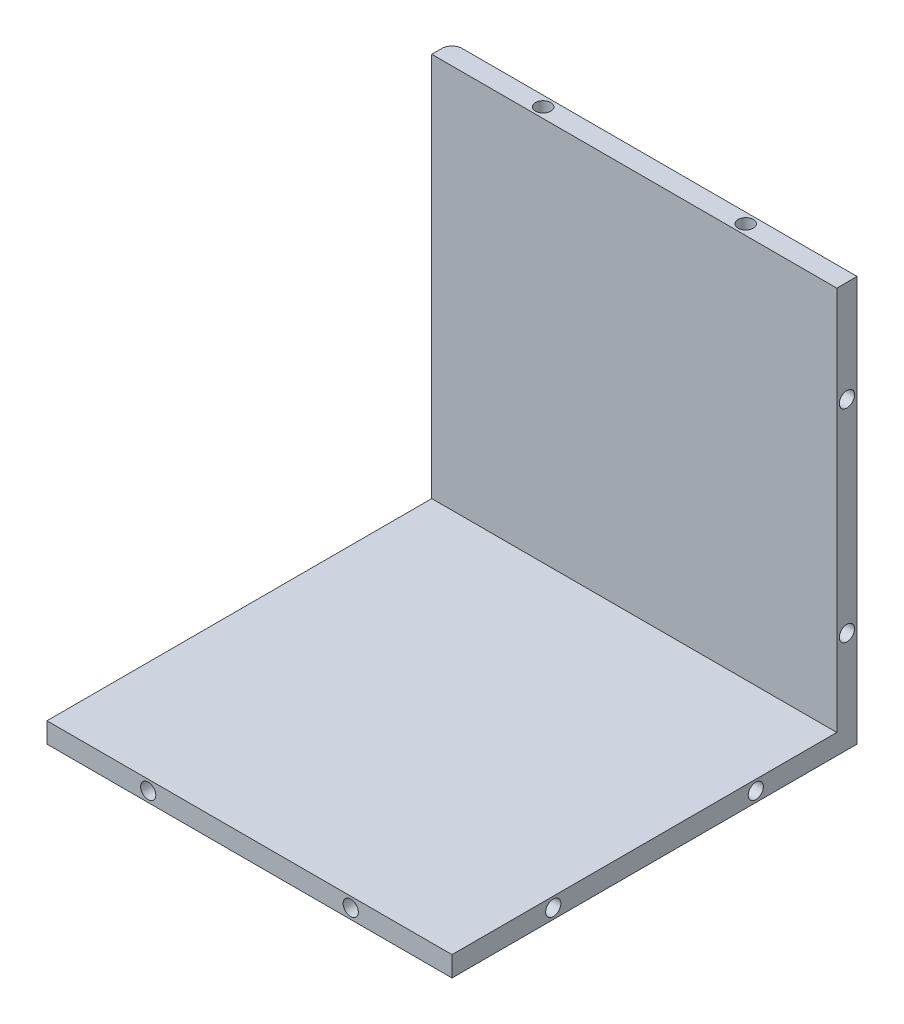
ISO-10303-21;
HEADER;
FILE_DESCRIPTION(('STEP AP214'),'2;1');
FILE_NAME('part.step','',(''),(''),'','','');
FILE_SCHEMA(('AUTOMOTIVE_DESIGN { 1 0 10303 214 1 1 1 1 }'));
ENDSEC;
DATA;
#1=APPLICATION_CONTEXT('core data for automotive mechanical design processes');
#2=APPLICATION_PROTOCOL_DEFINITION('international standard','automotive_design',2000,#1);
#3=PRODUCT_CONTEXT('',#1,'mechanical');
#4=PRODUCT('Part','Part','',(#3));
#5=PRODUCT_RELATED_PRODUCT_CATEGORY('part','',(#4));
#6=PRODUCT_DEFINITION_FORMATION('','',#4);
#7=PRODUCT_DEFINITION_CONTEXT('part definition',#1,'design');
#8=PRODUCT_DEFINITION('design','',#6,#7);
#9=PRODUCT_DEFINITION_SHAPE('','',#8);
#10=(LENGTH_UNIT() NAMED_UNIT(*) SI_UNIT(.MILLI.,.METRE.));
#11=(NAMED_UNIT(*) PLANE_ANGLE_UNIT() SI_UNIT($,.RADIAN.));
#12=(NAMED_UNIT(*) SI_UNIT($,.STERADIAN.) SOLID_ANGLE_UNIT());
#13=UNCERTAINTY_MEASURE_WITH_UNIT(LENGTH_MEASURE(1.E-05),#10,'distance_accuracy_value','');
#14=(GEOMETRIC_REPRESENTATION_CONTEXT(3) GLOBAL_UNCERTAINTY_ASSIGNED_CONTEXT((#13)) GLOBAL_UNIT_ASSIGNED_CONTEXT((#10,
#11,#12)) REPRESENTATION_CONTEXT('',''));
#15=CARTESIAN_POINT('',(0.,0.,0.));
#16=DIRECTION('',(0.,0.,1.));
#17=DIRECTION('',(1.,0.,0.));
#18=AXIS2_PLACEMENT_3D('',#15,#16,#17);
#19=CARTESIAN_POINT('',(80.,-2.,0.));
#20=DIRECTION('',(0.,-1.,0.));
#21=DIRECTION('',(0.,0.,-1.));
#22=AXIS2_PLACEMENT_3D('',#19,#20,#21);
#23=PLANE('',#22);
#24=CARTESIAN_POINT('',(3.75,-1.99999999999999,-103.5));
#25=DIRECTION('',(0.,-1.,0.));
#26=DIRECTION('',(0.,0.,-1.));
#27=AXIS2_PLACEMENT_3D('',#24,#25,#26);
#28=CIRCLE('',#27,1.5);
#29=CARTESIAN_POINT('',(3.75,-1.99999999999999,-105.));
#30=VERTEX_POINT('',#29);
#31=EDGE_CURVE('E257',#30,#30,#28,.T.);
#32=ORIENTED_EDGE('',*,*,#31,.F.);
#33=EDGE_LOOP('',(#32));
#34=FACE_BOUND('',#33,.T.);
#35=DIRECTION('',(0.,0.,1.));
#36=VECTOR('',#35,1.);
#37=CARTESIAN_POINT('',(40.,-2.,-110.));
#38=LINE('',#37,#36);
#39=CARTESIAN_POINT('',(40.,-2.,-110.));
#40=VERTEX_POINT('',#39);
#41=CARTESIAN_POINT('',(40.,-2.,-70.));
#42=VERTEX_POINT('',#41);
#43=EDGE_CURVE('E114',#40,#42,#38,.T.);
#44=ORIENTED_EDGE('',*,*,#43,.T.);
#45=DIRECTION('',(1.,0.,0.));
#46=VECTOR('',#45,1.);
#47=CARTESIAN_POINT('',(0.,-2.,-70.));
#48=LINE('',#47,#46);
#49=CARTESIAN_POINT('',(0.,-2.,-70.));
#50=VERTEX_POINT('',#49);
#51=EDGE_CURVE('E57',#50,#42,#48,.T.);
#52=ORIENTED_EDGE('',*,*,#51,.F.);
#53=DIRECTION('',(0.,0.,1.));
#54=VECTOR('',#53,1.);
#55=CARTESIAN_POINT('',(0.,-2.,0.));
#56=LINE('',#55,#54);
#57=CARTESIAN_POINT('',(0.,-1.99999999999999,-109.));
#58=VERTEX_POINT('',#57);
#59=EDGE_CURVE('E112',#58,#50,#56,.T.);
#60=ORIENTED_EDGE('',*,*,#59,.F.);
#61=CARTESIAN_POINT('',(1.,-1.99999999999999,-109.));
#62=DIRECTION('',(0.,-1.,0.));
#63=DIRECTION('',(0.,0.,-1.));
#64=AXIS2_PLACEMENT_3D('',#61,#62,#63);
#65=CIRCLE('',#64,1.);
#66=CARTESIAN_POINT('',(1.,-1.99999999999999,-110.));
#67=VERTEX_POINT('',#66);
#68=EDGE_CURVE('E147',#58,#67,#65,.T.);
#69=ORIENTED_EDGE('',*,*,#68,.T.);
#70=DIRECTION('',(-1.,0.,0.));
#71=VECTOR('',#70,1.);
#72=CARTESIAN_POINT('',(80.,-1.99999999999999,-110.));
#73=LINE('',#72,#71);
#74=EDGE_CURVE('E142',#40,#67,#73,.T.);
#75=ORIENTED_EDGE('',*,*,#74,.F.);
#76=EDGE_LOOP('',(#44,#52,#60,#69,#75));
#77=FACE_BOUND('',#76,.T.);
#78=ADVANCED_FACE('F41',(#34,#77),#23,.T.);
#79=CARTESIAN_POINT('',(80.,0.,0.));
#80=DIRECTION('',(0.,1.,0.));
#81=DIRECTION('',(0.,0.,1.));
#82=AXIS2_PLACEMENT_3D('',#79,#80,#81);
#83=PLANE('',#82);
#84=DIRECTION('',(0.,0.,-1.));
#85=VECTOR('',#84,1.);
#86=CARTESIAN_POINT('',(0.,0.,0.));
#87=LINE('',#86,#85);
#88=CARTESIAN_POINT('',(0.,0.,-70.));
#89=VERTEX_POINT('',#88);
#90=CARTESIAN_POINT('',(0.,0.,-108.));
#91=VERTEX_POINT('',#90);
#92=EDGE_CURVE('E130',#89,#91,#87,.T.);
#93=ORIENTED_EDGE('',*,*,#92,.F.);
#94=DIRECTION('',(-1.,0.,0.));
#95=VECTOR('',#94,1.);
#96=CARTESIAN_POINT('',(40.,0.,-70.));
#97=LINE('',#96,#95);
#98=CARTESIAN_POINT('',(40.,0.,-70.));
#99=VERTEX_POINT('',#98);
#100=EDGE_CURVE('E101',#99,#89,#97,.T.);
#101=ORIENTED_EDGE('',*,*,#100,.F.);
#102=DIRECTION('',(0.,0.,1.));
#103=VECTOR('',#102,1.);
#104=CARTESIAN_POINT('',(40.,0.,0.));
#105=LINE('',#104,#103);
#106=CARTESIAN_POINT('',(40.,0.,-108.));
#107=VERTEX_POINT('',#106);
#108=EDGE_CURVE('E132',#107,#99,#105,.T.);
#109=ORIENTED_EDGE('',*,*,#108,.F.);
#110=DIRECTION('',(-1.,0.,0.));
#111=VECTOR('',#110,1.);
#112=CARTESIAN_POINT('',(80.,0.,-108.));
#113=LINE('',#112,#111);
#114=EDGE_CURVE('E138',#107,#91,#113,.T.);
#115=ORIENTED_EDGE('',*,*,#114,.T.);
#116=EDGE_LOOP('',(#93,#101,#109,#115));
#117=FACE_BOUND('',#116,.T.);
#118=ADVANCED_FACE('F181',(#117),#83,.T.);
#119=CARTESIAN_POINT('',(0.,0.,0.));
#120=DIRECTION('',(1.,0.,0.));
#121=DIRECTION('',(0.,0.,-1.));
#122=AXIS2_PLACEMENT_3D('',#119,#120,#121);
#123=PLANE('',#122);
#124=DIRECTION('',(0.,-1.,0.));
#125=VECTOR('',#124,1.);
#126=CARTESIAN_POINT('',(0.,0.,-70.));
#127=LINE('',#126,#125);
#128=EDGE_CURVE('E98',#89,#50,#127,.T.);
#129=ORIENTED_EDGE('',*,*,#128,.F.);
#130=ORIENTED_EDGE('',*,*,#92,.T.);
#131=DIRECTION('',(0.,1.,0.));
#132=VECTOR('',#131,1.);
#133=CARTESIAN_POINT('',(0.,0.,-108.));
#134=LINE('',#133,#132);
#135=CARTESIAN_POINT('',(0.,38.,-108.));
#136=VERTEX_POINT('',#135);
#137=EDGE_CURVE('E124',#91,#136,#134,.T.);
#138=ORIENTED_EDGE('',*,*,#137,.T.);
#139=DIRECTION('',(0.,0.,1.));
#140=VECTOR('',#139,1.);
#141=CARTESIAN_POINT('',(0.,38.,-110.));
#142=LINE('',#141,#140);
#143=CARTESIAN_POINT('',(0.,38.,-109.));
#144=VERTEX_POINT('',#143);
#145=EDGE_CURVE('E157',#144,#136,#142,.T.);
#146=ORIENTED_EDGE('',*,*,#145,.F.);
#147=DIRECTION('',(0.,-1.,0.));
#148=VECTOR('',#147,1.);
#149=CARTESIAN_POINT('',(0.,-1.99999999999999,-109.));
#150=LINE('',#149,#148);
#151=EDGE_CURVE('E121',#144,#58,#150,.T.);
#152=ORIENTED_EDGE('',*,*,#151,.T.);
#153=ORIENTED_EDGE('',*,*,#59,.T.);
#154=EDGE_LOOP('',(#129,#130,#138,#146,#152,#153));
#155=FACE_BOUND('',#154,.T.);
#156=ADVANCED_FACE('F118',(#155),#123,.F.);
#157=CARTESIAN_POINT('',(40.,0.,-110.));
#158=DIRECTION('',(-1.,0.,0.));
#159=DIRECTION('',(0.,-1.,0.));
#160=AXIS2_PLACEMENT_3D('',#157,#158,#159);
#161=PLANE('',#160);
#162=CARTESIAN_POINT('',(40.,28.,-109.));
#163=DIRECTION('',(1.,0.,0.));
#164=DIRECTION('',(0.,0.,-1.));
#165=AXIS2_PLACEMENT_3D('',#162,#163,#164);
#166=CIRCLE('',#165,0.749999999999999);
#167=CARTESIAN_POINT('',(40.,28.,-109.75));
#168=VERTEX_POINT('',#167);
#169=EDGE_CURVE('E234',#168,#168,#166,.T.);
#170=ORIENTED_EDGE('',*,*,#169,.F.);
#171=EDGE_LOOP('',(#170));
#172=FACE_BOUND('',#171,.T.);
#173=CARTESIAN_POINT('',(40.,8.,-109.));
#174=DIRECTION('',(1.,0.,0.));
#175=DIRECTION('',(0.,0.,-1.));
#176=AXIS2_PLACEMENT_3D('',#173,#174,#175);
#177=CIRCLE('',#176,0.749999999999999);
#178=CARTESIAN_POINT('',(40.,8.,-109.75));
#179=VERTEX_POINT('',#178);
#180=EDGE_CURVE('E230',#179,#179,#177,.T.);
#181=ORIENTED_EDGE('',*,*,#180,.F.);
#182=EDGE_LOOP('',(#181));
#183=FACE_BOUND('',#182,.T.);
#184=CARTESIAN_POINT('',(40.,-0.999999999999994,-100.));
#185=DIRECTION('',(1.,0.,0.));
#186=DIRECTION('',(0.,0.,-1.));
#187=AXIS2_PLACEMENT_3D('',#184,#185,#186);
#188=CIRCLE('',#187,0.749999999999999);
#189=CARTESIAN_POINT('',(40.,-0.999999999999994,-100.75));
#190=VERTEX_POINT('',#189);
#191=EDGE_CURVE('E222',#190,#190,#188,.T.);
#192=ORIENTED_EDGE('',*,*,#191,.F.);
#193=EDGE_LOOP('',(#192));
#194=FACE_BOUND('',#193,.T.);
#195=CARTESIAN_POINT('',(40.,-0.999999999999995,-80.));
#196=DIRECTION('',(1.,0.,0.));
#197=DIRECTION('',(0.,0.,-1.));
#198=AXIS2_PLACEMENT_3D('',#195,#196,#197);
#199=CIRCLE('',#198,0.749999999999999);
#200=CARTESIAN_POINT('',(40.,-0.999999999999995,-80.75));
#201=VERTEX_POINT('',#200);
#202=EDGE_CURVE('E213',#201,#201,#199,.T.);
#203=ORIENTED_EDGE('',*,*,#202,.F.);
#204=EDGE_LOOP('',(#203));
#205=FACE_BOUND('',#204,.T.);
#206=DIRECTION('',(0.,1.,0.));
#207=VECTOR('',#206,1.);
#208=CARTESIAN_POINT('',(40.,-2.,-70.));
#209=LINE('',#208,#207);
#210=EDGE_CURVE('E116',#42,#99,#209,.T.);
#211=ORIENTED_EDGE('',*,*,#210,.F.);
#212=ORIENTED_EDGE('',*,*,#43,.F.);
#213=DIRECTION('',(0.,-1.,0.));
#214=VECTOR('',#213,1.);
#215=CARTESIAN_POINT('',(40.,0.,-110.));
#216=LINE('',#215,#214);
#217=CARTESIAN_POINT('',(40.,38.,-110.));
#218=VERTEX_POINT('',#217);
#219=EDGE_CURVE('E162',#218,#40,#216,.T.);
#220=ORIENTED_EDGE('',*,*,#219,.F.);
#221=DIRECTION('',(0.,0.,1.));
#222=VECTOR('',#221,1.);
#223=CARTESIAN_POINT('',(40.,38.,-110.));
#224=LINE('',#223,#222);
#225=CARTESIAN_POINT('',(40.,38.,-108.));
#226=VERTEX_POINT('',#225);
#227=EDGE_CURVE('E161',#218,#226,#224,.T.);
#228=ORIENTED_EDGE('',*,*,#227,.T.);
#229=DIRECTION('',(0.,-1.,0.));
#230=VECTOR('',#229,1.);
#231=CARTESIAN_POINT('',(40.,0.,-108.));
#232=LINE('',#231,#230);
#233=EDGE_CURVE('E125',#226,#107,#232,.T.);
#234=ORIENTED_EDGE('',*,*,#233,.T.);
#235=ORIENTED_EDGE('',*,*,#108,.T.);
#236=EDGE_LOOP('',(#211,#212,#220,#228,#234,#235));
#237=FACE_BOUND('',#236,.T.);
#238=ADVANCED_FACE('F177',(#172,#183,#194,#205,#237),#161,.F.);
#239=CARTESIAN_POINT('',(80.,0.,-110.));
#240=DIRECTION('',(0.,0.,-1.));
#241=DIRECTION('',(0.,1.,0.));
#242=AXIS2_PLACEMENT_3D('',#239,#240,#241);
#243=PLANE('',#242);
#244=ORIENTED_EDGE('',*,*,#219,.T.);
#245=ORIENTED_EDGE('',*,*,#74,.T.);
#246=DIRECTION('',(0.,-1.,0.));
#247=VECTOR('',#246,1.);
#248=CARTESIAN_POINT('',(1.,108.,-110.));
#249=LINE('',#248,#247);
#250=CARTESIAN_POINT('',(1.,38.,-110.));
#251=VERTEX_POINT('',#250);
#252=EDGE_CURVE('E50',#67,#251,#249,.F.);
#253=ORIENTED_EDGE('',*,*,#252,.T.);
#254=DIRECTION('',(1.,0.,0.));
#255=VECTOR('',#254,1.);
#256=CARTESIAN_POINT('',(0.,38.,-110.));
#257=LINE('',#256,#255);
#258=EDGE_CURVE('E64',#251,#218,#257,.T.);
#259=ORIENTED_EDGE('',*,*,#258,.T.);
#260=EDGE_LOOP('',(#244,#245,#253,#259));
#261=FACE_BOUND('',#260,.T.);
#262=ADVANCED_FACE('F154',(#261),#243,.T.);
#263=CARTESIAN_POINT('',(80.,0.,-108.));
#264=DIRECTION('',(0.,0.,1.));
#265=DIRECTION('',(1.,0.,0.));
#266=AXIS2_PLACEMENT_3D('',#263,#264,#265);
#267=PLANE('',#266);
#268=ORIENTED_EDGE('',*,*,#233,.F.);
#269=DIRECTION('',(1.,0.,0.));
#270=VECTOR('',#269,1.);
#271=CARTESIAN_POINT('',(80.,38.,-108.));
#272=LINE('',#271,#270);
#273=EDGE_CURVE('E171',#136,#226,#272,.T.);
#274=ORIENTED_EDGE('',*,*,#273,.F.);
#275=ORIENTED_EDGE('',*,*,#137,.F.);
#276=ORIENTED_EDGE('',*,*,#114,.F.);
#277=EDGE_LOOP('',(#268,#274,#275,#276));
#278=FACE_BOUND('',#277,.T.);
#279=ADVANCED_FACE('F183',(#278),#267,.T.);
#280=CARTESIAN_POINT('',(1.,0.,-109.));
#281=DIRECTION('',(0.,1.,0.));
#282=DIRECTION('',(0.,0.,1.));
#283=AXIS2_PLACEMENT_3D('',#280,#281,#282);
#284=CYLINDRICAL_SURFACE('',#283,1.);
#285=CARTESIAN_POINT('',(1.,38.,-109.));
#286=DIRECTION('',(0.,-1.,0.));
#287=DIRECTION('',(1.,0.,0.));
#288=AXIS2_PLACEMENT_3D('',#285,#286,#287);
#289=CIRCLE('',#288,1.);
#290=EDGE_CURVE('E11',#251,#144,#289,.F.);
#291=ORIENTED_EDGE('',*,*,#290,.F.);
#292=ORIENTED_EDGE('',*,*,#252,.F.);
#293=ORIENTED_EDGE('',*,*,#68,.F.);
#294=ORIENTED_EDGE('',*,*,#151,.F.);
#295=EDGE_LOOP('',(#291,#292,#293,#294));
#296=FACE_BOUND('',#295,.T.);
#297=ADVANCED_FACE('F43',(#296),#284,.T.);
#298=CARTESIAN_POINT('',(0.,38.,-110.));
#299=DIRECTION('',(0.,-1.,0.));
#300=DIRECTION('',(1.,0.,0.));
#301=AXIS2_PLACEMENT_3D('',#298,#299,#300);
#302=PLANE('',#301);
#303=CARTESIAN_POINT('',(30.,38.,-109.));
#304=DIRECTION('',(0.,1.,0.));
#305=DIRECTION('',(-1.,0.,0.));
#306=AXIS2_PLACEMENT_3D('',#303,#304,#305);
#307=CIRCLE('',#306,0.750000000000002);
#308=CARTESIAN_POINT('',(29.25,38.,-109.));
#309=VERTEX_POINT('',#308);
#310=EDGE_CURVE('E202',#309,#309,#307,.T.);
#311=ORIENTED_EDGE('',*,*,#310,.F.);
#312=EDGE_LOOP('',(#311));
#313=FACE_BOUND('',#312,.T.);
#314=CARTESIAN_POINT('',(10.,38.,-109.));
#315=DIRECTION('',(0.,1.,0.));
#316=DIRECTION('',(-1.,0.,0.));
#317=AXIS2_PLACEMENT_3D('',#314,#315,#316);
#318=CIRCLE('',#317,0.749999999999999);
#319=CARTESIAN_POINT('',(9.25000000000001,38.,-109.));
#320=VERTEX_POINT('',#319);
#321=EDGE_CURVE('E197',#320,#320,#318,.T.);
#322=ORIENTED_EDGE('',*,*,#321,.F.);
#323=EDGE_LOOP('',(#322));
#324=FACE_BOUND('',#323,.T.);
#325=ORIENTED_EDGE('',*,*,#273,.T.);
#326=ORIENTED_EDGE('',*,*,#227,.F.);
#327=ORIENTED_EDGE('',*,*,#258,.F.);
#328=ORIENTED_EDGE('',*,*,#290,.T.);
#329=ORIENTED_EDGE('',*,*,#145,.T.);
#330=EDGE_LOOP('',(#325,#326,#327,#328,#329));
#331=FACE_BOUND('',#330,.T.);
#332=ADVANCED_FACE('F156',(#313,#324,#331),#302,.F.);
#333=CARTESIAN_POINT('',(0.,0.,-70.));
#334=DIRECTION('',(0.,0.,1.));
#335=DIRECTION('',(1.,0.,0.));
#336=AXIS2_PLACEMENT_3D('',#333,#334,#335);
#337=PLANE('',#336);
#338=CARTESIAN_POINT('',(9.99999999999999,-1.,-70.));
#339=DIRECTION('',(0.,0.,1.));
#340=DIRECTION('',(1.,0.,0.));
#341=AXIS2_PLACEMENT_3D('',#338,#339,#340);
#342=CIRCLE('',#341,0.75);
#343=CARTESIAN_POINT('',(10.75,-1.,-70.));
#344=VERTEX_POINT('',#343);
#345=EDGE_CURVE('E250',#344,#344,#342,.T.);
#346=ORIENTED_EDGE('',*,*,#345,.F.);
#347=EDGE_LOOP('',(#346));
#348=FACE_BOUND('',#347,.T.);
#349=CARTESIAN_POINT('',(30.,-1.,-70.));
#350=DIRECTION('',(0.,0.,1.));
#351=DIRECTION('',(1.,0.,0.));
#352=AXIS2_PLACEMENT_3D('',#349,#350,#351);
#353=CIRCLE('',#352,0.750000000000002);
#354=CARTESIAN_POINT('',(30.75,-1.,-70.));
#355=VERTEX_POINT('',#354);
#356=EDGE_CURVE('E245',#355,#355,#353,.T.);
#357=ORIENTED_EDGE('',*,*,#356,.F.);
#358=EDGE_LOOP('',(#357));
#359=FACE_BOUND('',#358,.T.);
#360=ORIENTED_EDGE('',*,*,#128,.T.);
#361=ORIENTED_EDGE('',*,*,#51,.T.);
#362=ORIENTED_EDGE('',*,*,#210,.T.);
#363=ORIENTED_EDGE('',*,*,#100,.T.);
#364=EDGE_LOOP('',(#360,#361,#362,#363));
#365=FACE_BOUND('',#364,.T.);
#366=ADVANCED_FACE('F99',(#348,#359,#365),#337,.T.);
#367=CARTESIAN_POINT('',(10.,33.,-109.));
#368=DIRECTION('',(0.,1.,0.));
#369=DIRECTION('',(-1.,0.,0.));
#370=AXIS2_PLACEMENT_3D('',#367,#368,#369);
#371=CYLINDRICAL_SURFACE('',#370,0.749999999999999);
#372=CARTESIAN_POINT('',(10.,33.,-109.));
#373=DIRECTION('',(0.,1.,0.));
#374=DIRECTION('',(-1.,0.,0.));
#375=AXIS2_PLACEMENT_3D('',#372,#373,#374);
#376=CIRCLE('',#375,0.749999999999999);
#377=CARTESIAN_POINT('',(9.25000000000001,33.,-109.));
#378=VERTEX_POINT('',#377);
#379=EDGE_CURVE('E193',#378,#378,#376,.T.);
#380=ORIENTED_EDGE('',*,*,#379,.F.);
#381=EDGE_LOOP('',(#380));
#382=FACE_BOUND('',#381,.T.);
#383=ORIENTED_EDGE('',*,*,#321,.T.);
#384=EDGE_LOOP('',(#383));
#385=FACE_BOUND('',#384,.T.);
#386=ADVANCED_FACE('F294',(#382,#385),#371,.F.);
#387=CARTESIAN_POINT('',(10.,33.,-109.));
#388=DIRECTION('',(0.,1.,0.));
#389=DIRECTION('',(-1.,0.,0.));
#390=AXIS2_PLACEMENT_3D('',#387,#388,#389);
#391=PLANE('',#390);
#392=ORIENTED_EDGE('',*,*,#379,.T.);
#393=EDGE_LOOP('',(#392));
#394=FACE_BOUND('',#393,.T.);
#395=ADVANCED_FACE('F296',(#394),#391,.T.);
#396=CARTESIAN_POINT('',(30.,33.,-109.));
#397=DIRECTION('',(0.,1.,0.));
#398=DIRECTION('',(-1.,0.,0.));
#399=AXIS2_PLACEMENT_3D('',#396,#397,#398);
#400=CYLINDRICAL_SURFACE('',#399,0.750000000000002);
#401=CARTESIAN_POINT('',(30.,33.,-109.));
#402=DIRECTION('',(0.,1.,0.));
#403=DIRECTION('',(-1.,0.,0.));
#404=AXIS2_PLACEMENT_3D('',#401,#402,#403);
#405=CIRCLE('',#404,0.750000000000002);
#406=CARTESIAN_POINT('',(29.25,33.,-109.));
#407=VERTEX_POINT('',#406);
#408=EDGE_CURVE('E106',#407,#407,#405,.T.);
#409=ORIENTED_EDGE('',*,*,#408,.F.);
#410=EDGE_LOOP('',(#409));
#411=FACE_BOUND('',#410,.T.);
#412=ORIENTED_EDGE('',*,*,#310,.T.);
#413=EDGE_LOOP('',(#412));
#414=FACE_BOUND('',#413,.T.);
#415=ADVANCED_FACE('F299',(#411,#414),#400,.F.);
#416=CARTESIAN_POINT('',(30.,33.,-109.));
#417=DIRECTION('',(0.,1.,0.));
#418=DIRECTION('',(-1.,0.,0.));
#419=AXIS2_PLACEMENT_3D('',#416,#417,#418);
#420=PLANE('',#419);
#421=ORIENTED_EDGE('',*,*,#408,.T.);
#422=EDGE_LOOP('',(#421));
#423=FACE_BOUND('',#422,.T.);
#424=ADVANCED_FACE('F306',(#423),#420,.T.);
#425=CARTESIAN_POINT('',(35.,-0.999999999999995,-80.));
#426=DIRECTION('',(1.,0.,0.));
#427=DIRECTION('',(0.,0.,-1.));
#428=AXIS2_PLACEMENT_3D('',#425,#426,#427);
#429=CYLINDRICAL_SURFACE('',#428,0.749999999999999);
#430=CARTESIAN_POINT('',(35.,-0.999999999999995,-80.));
#431=DIRECTION('',(1.,0.,0.));
#432=DIRECTION('',(0.,0.,-1.));
#433=AXIS2_PLACEMENT_3D('',#430,#431,#432);
#434=CIRCLE('',#433,0.749999999999999);
#435=CARTESIAN_POINT('',(35.,-0.999999999999995,-80.75));
#436=VERTEX_POINT('',#435);
#437=EDGE_CURVE('E209',#436,#436,#434,.T.);
#438=ORIENTED_EDGE('',*,*,#437,.F.);
#439=EDGE_LOOP('',(#438));
#440=FACE_BOUND('',#439,.T.);
#441=ORIENTED_EDGE('',*,*,#202,.T.);
#442=EDGE_LOOP('',(#441));
#443=FACE_BOUND('',#442,.T.);
#444=ADVANCED_FACE('F310',(#440,#443),#429,.F.);
#445=CARTESIAN_POINT('',(35.,-0.999999999999995,-80.));
#446=DIRECTION('',(1.,0.,0.));
#447=DIRECTION('',(0.,0.,-1.));
#448=AXIS2_PLACEMENT_3D('',#445,#446,#447);
#449=PLANE('',#448);
#450=ORIENTED_EDGE('',*,*,#437,.T.);
#451=EDGE_LOOP('',(#450));
#452=FACE_BOUND('',#451,.T.);
#453=ADVANCED_FACE('F312',(#452),#449,.T.);
#454=CARTESIAN_POINT('',(35.,-0.999999999999994,-100.));
#455=DIRECTION('',(1.,0.,0.));
#456=DIRECTION('',(0.,0.,-1.));
#457=AXIS2_PLACEMENT_3D('',#454,#455,#456);
#458=CYLINDRICAL_SURFACE('',#457,0.749999999999999);
#459=CARTESIAN_POINT('',(35.,-0.999999999999994,-100.));
#460=DIRECTION('',(1.,0.,0.));
#461=DIRECTION('',(0.,0.,-1.));
#462=AXIS2_PLACEMENT_3D('',#459,#460,#461);
#463=CIRCLE('',#462,0.749999999999999);
#464=CARTESIAN_POINT('',(35.,-0.999999999999994,-100.75));
#465=VERTEX_POINT('',#464);
#466=EDGE_CURVE('E218',#465,#465,#463,.T.);
#467=ORIENTED_EDGE('',*,*,#466,.F.);
#468=EDGE_LOOP('',(#467));
#469=FACE_BOUND('',#468,.T.);
#470=ORIENTED_EDGE('',*,*,#191,.T.);
#471=EDGE_LOOP('',(#470));
#472=FACE_BOUND('',#471,.T.);
#473=ADVANCED_FACE('F315',(#469,#472),#458,.F.);
#474=CARTESIAN_POINT('',(35.,-0.999999999999994,-100.));
#475=DIRECTION('',(1.,0.,0.));
#476=DIRECTION('',(0.,0.,-1.));
#477=AXIS2_PLACEMENT_3D('',#474,#475,#476);
#478=PLANE('',#477);
#479=ORIENTED_EDGE('',*,*,#466,.T.);
#480=EDGE_LOOP('',(#479));
#481=FACE_BOUND('',#480,.T.);
#482=ADVANCED_FACE('F320',(#481),#478,.T.);
#483=CARTESIAN_POINT('',(35.,8.,-109.));
#484=DIRECTION('',(1.,0.,0.));
#485=DIRECTION('',(0.,0.,-1.));
#486=AXIS2_PLACEMENT_3D('',#483,#484,#485);
#487=CYLINDRICAL_SURFACE('',#486,0.749999999999999);
#488=CARTESIAN_POINT('',(35.,8.,-109.));
#489=DIRECTION('',(1.,0.,0.));
#490=DIRECTION('',(0.,0.,-1.));
#491=AXIS2_PLACEMENT_3D('',#488,#489,#490);
#492=CIRCLE('',#491,0.749999999999999);
#493=CARTESIAN_POINT('',(35.,8.,-109.75));
#494=VERTEX_POINT('',#493);
#495=EDGE_CURVE('E226',#494,#494,#492,.T.);
#496=ORIENTED_EDGE('',*,*,#495,.F.);
#497=EDGE_LOOP('',(#496));
#498=FACE_BOUND('',#497,.T.);
#499=ORIENTED_EDGE('',*,*,#180,.T.);
#500=EDGE_LOOP('',(#499));
#501=FACE_BOUND('',#500,.T.);
#502=ADVANCED_FACE('F323',(#498,#501),#487,.F.);
#503=CARTESIAN_POINT('',(35.,8.,-109.));
#504=DIRECTION('',(1.,0.,0.));
#505=DIRECTION('',(0.,0.,-1.));
#506=AXIS2_PLACEMENT_3D('',#503,#504,#505);
#507=PLANE('',#506);
#508=ORIENTED_EDGE('',*,*,#495,.T.);
#509=EDGE_LOOP('',(#508));
#510=FACE_BOUND('',#509,.T.);
#511=ADVANCED_FACE('F328',(#510),#507,.T.);
#512=CARTESIAN_POINT('',(35.,28.,-109.));
#513=DIRECTION('',(1.,0.,0.));
#514=DIRECTION('',(0.,0.,-1.));
#515=AXIS2_PLACEMENT_3D('',#512,#513,#514);
#516=CYLINDRICAL_SURFACE('',#515,0.749999999999999);
#517=CARTESIAN_POINT('',(35.,28.,-109.));
#518=DIRECTION('',(1.,0.,0.));
#519=DIRECTION('',(0.,0.,-1.));
#520=AXIS2_PLACEMENT_3D('',#517,#518,#519);
#521=CIRCLE('',#520,0.749999999999999);
#522=CARTESIAN_POINT('',(35.,28.,-109.75));
#523=VERTEX_POINT('',#522);
#524=EDGE_CURVE('E198',#523,#523,#521,.T.);
#525=ORIENTED_EDGE('',*,*,#524,.F.);
#526=EDGE_LOOP('',(#525));
#527=FACE_BOUND('',#526,.T.);
#528=ORIENTED_EDGE('',*,*,#169,.T.);
#529=EDGE_LOOP('',(#528));
#530=FACE_BOUND('',#529,.T.);
#531=ADVANCED_FACE('F331',(#527,#530),#516,.F.);
#532=CARTESIAN_POINT('',(35.,28.,-109.));
#533=DIRECTION('',(1.,0.,0.));
#534=DIRECTION('',(0.,0.,-1.));
#535=AXIS2_PLACEMENT_3D('',#532,#533,#534);
#536=PLANE('',#535);
#537=ORIENTED_EDGE('',*,*,#524,.T.);
#538=EDGE_LOOP('',(#537));
#539=FACE_BOUND('',#538,.T.);
#540=ADVANCED_FACE('F338',(#539),#536,.T.);
#541=CARTESIAN_POINT('',(30.,-1.,-75.));
#542=DIRECTION('',(0.,0.,1.));
#543=DIRECTION('',(1.,0.,0.));
#544=AXIS2_PLACEMENT_3D('',#541,#542,#543);
#545=CYLINDRICAL_SURFACE('',#544,0.750000000000002);
#546=CARTESIAN_POINT('',(30.,-1.,-75.));
#547=DIRECTION('',(0.,0.,1.));
#548=DIRECTION('',(1.,0.,0.));
#549=AXIS2_PLACEMENT_3D('',#546,#547,#548);
#550=CIRCLE('',#549,0.750000000000002);
#551=CARTESIAN_POINT('',(30.75,-1.,-75.));
#552=VERTEX_POINT('',#551);
#553=EDGE_CURVE('E241',#552,#552,#550,.T.);
#554=ORIENTED_EDGE('',*,*,#553,.F.);
#555=EDGE_LOOP('',(#554));
#556=FACE_BOUND('',#555,.T.);
#557=ORIENTED_EDGE('',*,*,#356,.T.);
#558=EDGE_LOOP('',(#557));
#559=FACE_BOUND('',#558,.T.);
#560=ADVANCED_FACE('F342',(#556,#559),#545,.F.);
#561=CARTESIAN_POINT('',(30.,-1.,-75.));
#562=DIRECTION('',(0.,0.,1.));
#563=DIRECTION('',(1.,0.,0.));
#564=AXIS2_PLACEMENT_3D('',#561,#562,#563);
#565=PLANE('',#564);
#566=ORIENTED_EDGE('',*,*,#553,.T.);
#567=EDGE_LOOP('',(#566));
#568=FACE_BOUND('',#567,.T.);
#569=ADVANCED_FACE('F344',(#568),#565,.T.);
#570=CARTESIAN_POINT('',(9.99999999999999,-1.,-75.));
#571=DIRECTION('',(0.,0.,1.));
#572=DIRECTION('',(1.,0.,0.));
#573=AXIS2_PLACEMENT_3D('',#570,#571,#572);
#574=CYLINDRICAL_SURFACE('',#573,0.75);
#575=CARTESIAN_POINT('',(9.99999999999999,-1.,-75.));
#576=DIRECTION('',(0.,0.,1.));
#577=DIRECTION('',(1.,0.,0.));
#578=AXIS2_PLACEMENT_3D('',#575,#576,#577);
#579=CIRCLE('',#578,0.75);
#580=CARTESIAN_POINT('',(10.75,-1.,-75.));
#581=VERTEX_POINT('',#580);
#582=EDGE_CURVE('E214',#581,#581,#579,.T.);
#583=ORIENTED_EDGE('',*,*,#582,.F.);
#584=EDGE_LOOP('',(#583));
#585=FACE_BOUND('',#584,.T.);
#586=ORIENTED_EDGE('',*,*,#345,.T.);
#587=EDGE_LOOP('',(#586));
#588=FACE_BOUND('',#587,.T.);
#589=ADVANCED_FACE('F347',(#585,#588),#574,.F.);
#590=CARTESIAN_POINT('',(9.99999999999999,-1.,-75.));
#591=DIRECTION('',(0.,0.,1.));
#592=DIRECTION('',(1.,0.,0.));
#593=AXIS2_PLACEMENT_3D('',#590,#591,#592);
#594=PLANE('',#593);
#595=ORIENTED_EDGE('',*,*,#582,.T.);
#596=EDGE_LOOP('',(#595));
#597=FACE_BOUND('',#596,.T.);
#598=ADVANCED_FACE('F270',(#597),#594,.T.);
#599=CARTESIAN_POINT('',(3.75,-0.999999999999987,-103.5));
#600=DIRECTION('',(0.,-1.,0.));
#601=DIRECTION('',(0.,0.,-1.));
#602=AXIS2_PLACEMENT_3D('',#599,#600,#601);
#603=CYLINDRICAL_SURFACE('',#602,1.5);
#604=CARTESIAN_POINT('',(3.75,-0.999999999999987,-103.5));
#605=DIRECTION('',(0.,-1.,0.));
#606=DIRECTION('',(0.,0.,-1.));
#607=AXIS2_PLACEMENT_3D('',#604,#605,#606);
#608=CIRCLE('',#607,1.5);
#609=CARTESIAN_POINT('',(3.75,-0.999999999999987,-105.));
#610=VERTEX_POINT('',#609);
#611=EDGE_CURVE('E246',#610,#610,#608,.T.);
#612=ORIENTED_EDGE('',*,*,#611,.F.);
#613=EDGE_LOOP('',(#612));
#614=FACE_BOUND('',#613,.T.);
#615=ORIENTED_EDGE('',*,*,#31,.T.);
#616=EDGE_LOOP('',(#615));
#617=FACE_BOUND('',#616,.T.);
#618=ADVANCED_FACE('F267',(#614,#617),#603,.F.);
#619=CARTESIAN_POINT('',(3.75,-0.999999999999987,-103.5));
#620=DIRECTION('',(0.,-1.,0.));
#621=DIRECTION('',(0.,0.,-1.));
#622=AXIS2_PLACEMENT_3D('',#619,#620,#621);
#623=PLANE('',#622);
#624=ORIENTED_EDGE('',*,*,#611,.T.);
#625=EDGE_LOOP('',(#624));
#626=FACE_BOUND('',#625,.T.);
#627=ADVANCED_FACE('F265',(#626),#623,.T.);
#628=CLOSED_SHELL('',(#78,#118,#156,#238,#262,#279,#297,#332,#366,#386,#395,#415,#424,#444,#453,
#473,#482,#502,#511,#531,#540,#560,#569,#589,#598,#618,#627));
#629=MANIFOLD_SOLID_BREP('B2',#628);
#630=ADVANCED_BREP_SHAPE_REPRESENTATION('',(#18,#629),#14);
#631=SHAPE_DEFINITION_REPRESENTATION(#9,#630);
ENDSEC;
END-ISO-10303-21;
